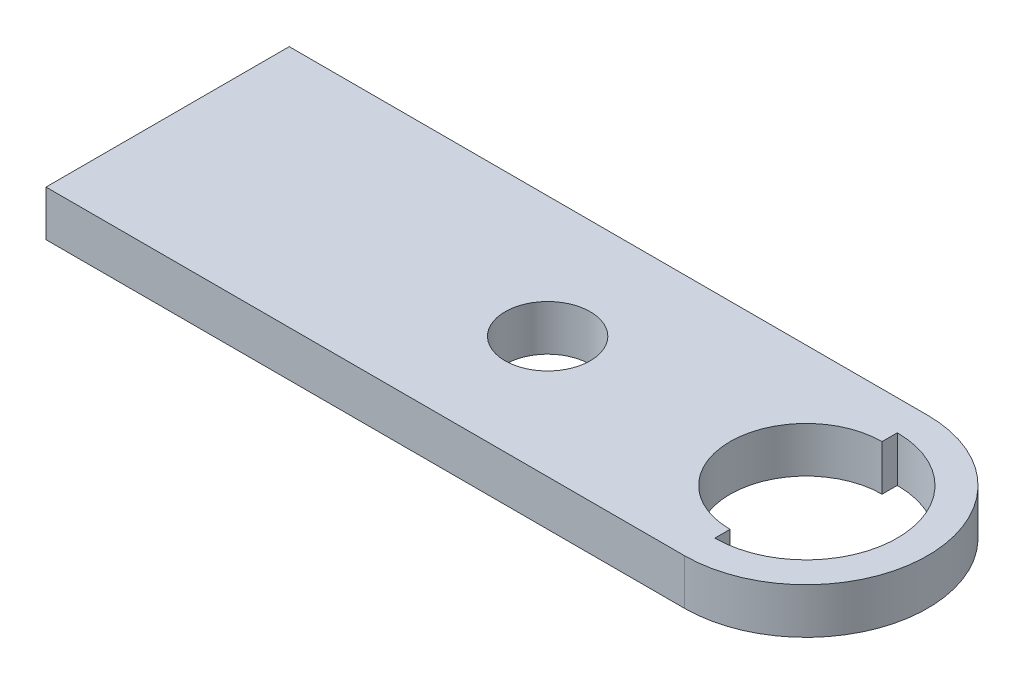
ISO-10303-21;
HEADER;
FILE_DESCRIPTION(('STEP AP214'),'2;1');
FILE_NAME('part.step','',(''),(''),'','','');
FILE_SCHEMA(('AUTOMOTIVE_DESIGN { 1 0 10303 214 1 1 1 1 }'));
ENDSEC;
DATA;
#1=APPLICATION_CONTEXT('core data for automotive mechanical design processes');
#2=APPLICATION_PROTOCOL_DEFINITION('international standard','automotive_design',2000,#1);
#3=PRODUCT_CONTEXT('',#1,'mechanical');
#4=PRODUCT('Part','Part','',(#3));
#5=PRODUCT_RELATED_PRODUCT_CATEGORY('part','',(#4));
#6=PRODUCT_DEFINITION_FORMATION('','',#4);
#7=PRODUCT_DEFINITION_CONTEXT('part definition',#1,'design');
#8=PRODUCT_DEFINITION('design','',#6,#7);
#9=PRODUCT_DEFINITION_SHAPE('','',#8);
#10=(LENGTH_UNIT() NAMED_UNIT(*) SI_UNIT(.MILLI.,.METRE.));
#11=(NAMED_UNIT(*) PLANE_ANGLE_UNIT() SI_UNIT($,.RADIAN.));
#12=(NAMED_UNIT(*) SI_UNIT($,.STERADIAN.) SOLID_ANGLE_UNIT());
#13=UNCERTAINTY_MEASURE_WITH_UNIT(LENGTH_MEASURE(1.E-05),#10,'distance_accuracy_value','');
#14=(GEOMETRIC_REPRESENTATION_CONTEXT(3) GLOBAL_UNCERTAINTY_ASSIGNED_CONTEXT((#13)) GLOBAL_UNIT_ASSIGNED_CONTEXT((#10,
#11,#12)) REPRESENTATION_CONTEXT('',''));
#15=CARTESIAN_POINT('',(0.,0.,0.));
#16=DIRECTION('',(0.,0.,1.));
#17=DIRECTION('',(1.,0.,0.));
#18=AXIS2_PLACEMENT_3D('',#15,#16,#17);
#19=CARTESIAN_POINT('',(95.2231224646768,15.,0.));
#20=DIRECTION('',(0.,1.,0.));
#21=DIRECTION('',(0.,0.,1.));
#22=AXIS2_PLACEMENT_3D('',#19,#20,#21);
#23=PLANE('',#22);
#24=CARTESIAN_POINT('',(10.2231224646768,15.,0.));
#25=DIRECTION('',(0.,1.,0.));
#26=DIRECTION('',(0.,0.,1.));
#27=AXIS2_PLACEMENT_3D('',#24,#25,#26);
#28=CIRCLE('',#27,14.);
#29=CARTESIAN_POINT('',(10.2231224646768,15.,14.));
#30=VERTEX_POINT('',#29);
#31=EDGE_CURVE('E254',#30,#30,#28,.T.);
#32=ORIENTED_EDGE('',*,*,#31,.F.);
#33=EDGE_LOOP('',(#32));
#34=FACE_BOUND('',#33,.T.);
#35=DIRECTION('',(0.,0.,1.));
#36=VECTOR('',#35,1.);
#37=CARTESIAN_POINT('',(-114.776877535323,15.,-40.));
#38=LINE('',#37,#36);
#39=CARTESIAN_POINT('',(-114.776877535323,15.,-40.));
#40=VERTEX_POINT('',#39);
#41=CARTESIAN_POINT('',(-114.776877535323,15.,40.));
#42=VERTEX_POINT('',#41);
#43=EDGE_CURVE('E155',#40,#42,#38,.T.);
#44=ORIENTED_EDGE('',*,*,#43,.T.);
#45=DIRECTION('',(1.,0.,0.));
#46=VECTOR('',#45,1.);
#47=CARTESIAN_POINT('',(-114.776877535323,15.,40.));
#48=LINE('',#47,#46);
#49=CARTESIAN_POINT('',(95.2231224646768,15.,40.));
#50=VERTEX_POINT('',#49);
#51=EDGE_CURVE('E159',#42,#50,#48,.T.);
#52=ORIENTED_EDGE('',*,*,#51,.T.);
#53=CARTESIAN_POINT('',(95.2231224646768,15.,0.));
#54=DIRECTION('',(0.,1.,0.));
#55=DIRECTION('',(0.,0.,1.));
#56=AXIS2_PLACEMENT_3D('',#53,#54,#55);
#57=CIRCLE('',#56,40.);
#58=CARTESIAN_POINT('',(95.2231224646768,15.,-40.));
#59=VERTEX_POINT('',#58);
#60=EDGE_CURVE('E163',#50,#59,#57,.T.);
#61=ORIENTED_EDGE('',*,*,#60,.T.);
#62=DIRECTION('',(-1.,0.,0.));
#63=VECTOR('',#62,1.);
#64=CARTESIAN_POINT('',(-114.776877535323,15.,-40.));
#65=LINE('',#64,#63);
#66=EDGE_CURVE('E166',#59,#40,#65,.T.);
#67=ORIENTED_EDGE('',*,*,#66,.T.);
#68=EDGE_LOOP('',(#44,#52,#61,#67));
#69=FACE_BOUND('',#68,.T.);
#70=DIRECTION('',(0.,0.,1.));
#71=VECTOR('',#70,1.);
#72=CARTESIAN_POINT('',(95.2231224646768,15.,-30.));
#73=LINE('',#72,#71);
#74=CARTESIAN_POINT('',(95.2231224646768,15.,-30.));
#75=VERTEX_POINT('',#74);
#76=CARTESIAN_POINT('',(95.2231224646768,15.,-25.));
#77=VERTEX_POINT('',#76);
#78=EDGE_CURVE('E114',#75,#77,#73,.T.);
#79=ORIENTED_EDGE('',*,*,#78,.F.);
#80=CARTESIAN_POINT('',(95.2231224646768,15.,0.));
#81=DIRECTION('',(0.,1.,0.));
#82=DIRECTION('',(0.,0.,1.));
#83=AXIS2_PLACEMENT_3D('',#80,#81,#82);
#84=CIRCLE('',#83,30.);
#85=CARTESIAN_POINT('',(95.2231224646768,15.,30.));
#86=VERTEX_POINT('',#85);
#87=EDGE_CURVE('E105',#86,#75,#84,.T.);
#88=ORIENTED_EDGE('',*,*,#87,.F.);
#89=DIRECTION('',(0.,0.,1.));
#90=VECTOR('',#89,1.);
#91=CARTESIAN_POINT('',(95.2231224646768,15.,25.));
#92=LINE('',#91,#90);
#93=CARTESIAN_POINT('',(95.2231224646768,15.,25.));
#94=VERTEX_POINT('',#93);
#95=EDGE_CURVE('E131',#94,#86,#92,.T.);
#96=ORIENTED_EDGE('',*,*,#95,.F.);
#97=CARTESIAN_POINT('',(95.2231224646768,15.,0.));
#98=DIRECTION('',(0.,1.,0.));
#99=DIRECTION('',(0.,0.,1.));
#100=AXIS2_PLACEMENT_3D('',#97,#98,#99);
#101=CIRCLE('',#100,25.);
#102=EDGE_CURVE('E127',#77,#94,#101,.T.);
#103=ORIENTED_EDGE('',*,*,#102,.F.);
#104=EDGE_LOOP('',(#79,#88,#96,#103));
#105=FACE_BOUND('',#104,.T.);
#106=ADVANCED_FACE('F39',(#34,#69,#105),#23,.T.);
#107=CARTESIAN_POINT('',(95.2231224646768,0.,0.));
#108=DIRECTION('',(0.,1.,0.));
#109=DIRECTION('',(0.,0.,1.));
#110=AXIS2_PLACEMENT_3D('',#107,#108,#109);
#111=PLANE('',#110);
#112=CARTESIAN_POINT('',(10.2231224646768,0.,0.));
#113=DIRECTION('',(0.,1.,0.));
#114=DIRECTION('',(0.,0.,1.));
#115=AXIS2_PLACEMENT_3D('',#112,#113,#114);
#116=CIRCLE('',#115,14.);
#117=CARTESIAN_POINT('',(10.2231224646768,0.,14.));
#118=VERTEX_POINT('',#117);
#119=EDGE_CURVE('E139',#118,#118,#116,.T.);
#120=ORIENTED_EDGE('',*,*,#119,.T.);
#121=EDGE_LOOP('',(#120));
#122=FACE_BOUND('',#121,.T.);
#123=DIRECTION('',(0.,0.,1.));
#124=VECTOR('',#123,1.);
#125=CARTESIAN_POINT('',(-114.776877535323,0.,-40.));
#126=LINE('',#125,#124);
#127=CARTESIAN_POINT('',(-114.776877535323,0.,-40.));
#128=VERTEX_POINT('',#127);
#129=CARTESIAN_POINT('',(-114.776877535323,0.,40.));
#130=VERTEX_POINT('',#129);
#131=EDGE_CURVE('E123',#128,#130,#126,.T.);
#132=ORIENTED_EDGE('',*,*,#131,.F.);
#133=DIRECTION('',(-1.,0.,0.));
#134=VECTOR('',#133,1.);
#135=CARTESIAN_POINT('',(-114.776877535323,0.,-40.));
#136=LINE('',#135,#134);
#137=CARTESIAN_POINT('',(95.2231224646768,0.,-40.));
#138=VERTEX_POINT('',#137);
#139=EDGE_CURVE('E160',#138,#128,#136,.T.);
#140=ORIENTED_EDGE('',*,*,#139,.F.);
#141=CARTESIAN_POINT('',(95.2231224646768,0.,0.));
#142=DIRECTION('',(0.,1.,0.));
#143=DIRECTION('',(0.,0.,1.));
#144=AXIS2_PLACEMENT_3D('',#141,#142,#143);
#145=CIRCLE('',#144,40.);
#146=CARTESIAN_POINT('',(95.2231224646768,0.,40.));
#147=VERTEX_POINT('',#146);
#148=EDGE_CURVE('E176',#147,#138,#145,.T.);
#149=ORIENTED_EDGE('',*,*,#148,.F.);
#150=DIRECTION('',(1.,0.,0.));
#151=VECTOR('',#150,1.);
#152=CARTESIAN_POINT('',(-114.776877535323,0.,40.));
#153=LINE('',#152,#151);
#154=EDGE_CURVE('E173',#130,#147,#153,.T.);
#155=ORIENTED_EDGE('',*,*,#154,.F.);
#156=EDGE_LOOP('',(#132,#140,#149,#155));
#157=FACE_BOUND('',#156,.T.);
#158=CARTESIAN_POINT('',(95.2231224646768,0.,0.));
#159=DIRECTION('',(0.,1.,0.));
#160=DIRECTION('',(0.,0.,1.));
#161=AXIS2_PLACEMENT_3D('',#158,#159,#160);
#162=CIRCLE('',#161,30.);
#163=CARTESIAN_POINT('',(95.2231224646768,0.,30.));
#164=VERTEX_POINT('',#163);
#165=CARTESIAN_POINT('',(95.2231224646768,0.,-30.));
#166=VERTEX_POINT('',#165);
#167=EDGE_CURVE('E63',#164,#166,#162,.T.);
#168=ORIENTED_EDGE('',*,*,#167,.T.);
#169=DIRECTION('',(0.,0.,1.));
#170=VECTOR('',#169,1.);
#171=CARTESIAN_POINT('',(95.2231224646768,0.,-30.));
#172=LINE('',#171,#170);
#173=CARTESIAN_POINT('',(95.2231224646768,0.,-25.));
#174=VERTEX_POINT('',#173);
#175=EDGE_CURVE('E121',#166,#174,#172,.T.);
#176=ORIENTED_EDGE('',*,*,#175,.T.);
#177=CARTESIAN_POINT('',(95.2231224646768,0.,0.));
#178=DIRECTION('',(0.,1.,0.));
#179=DIRECTION('',(0.,0.,1.));
#180=AXIS2_PLACEMENT_3D('',#177,#178,#179);
#181=CIRCLE('',#180,25.);
#182=CARTESIAN_POINT('',(95.2231224646768,0.,25.));
#183=VERTEX_POINT('',#182);
#184=EDGE_CURVE('E142',#174,#183,#181,.T.);
#185=ORIENTED_EDGE('',*,*,#184,.T.);
#186=DIRECTION('',(0.,0.,1.));
#187=VECTOR('',#186,1.);
#188=CARTESIAN_POINT('',(95.2231224646768,0.,25.));
#189=LINE('',#188,#187);
#190=EDGE_CURVE('E115',#183,#164,#189,.T.);
#191=ORIENTED_EDGE('',*,*,#190,.T.);
#192=EDGE_LOOP('',(#168,#176,#185,#191));
#193=FACE_BOUND('',#192,.T.);
#194=ADVANCED_FACE('F199',(#122,#157,#193),#111,.F.);
#195=CARTESIAN_POINT('',(-114.776877535323,15.,-40.));
#196=DIRECTION('',(1.,0.,0.));
#197=DIRECTION('',(0.,0.,-1.));
#198=AXIS2_PLACEMENT_3D('',#195,#196,#197);
#199=PLANE('',#198);
#200=ORIENTED_EDGE('',*,*,#131,.T.);
#201=DIRECTION('',(0.,-1.,0.));
#202=VECTOR('',#201,1.);
#203=CARTESIAN_POINT('',(-114.776877535323,15.,40.));
#204=LINE('',#203,#202);
#205=EDGE_CURVE('E11',#42,#130,#204,.T.);
#206=ORIENTED_EDGE('',*,*,#205,.F.);
#207=ORIENTED_EDGE('',*,*,#43,.F.);
#208=DIRECTION('',(0.,-1.,0.));
#209=VECTOR('',#208,1.);
#210=CARTESIAN_POINT('',(-114.776877535323,15.,-40.));
#211=LINE('',#210,#209);
#212=EDGE_CURVE('E169',#40,#128,#211,.T.);
#213=ORIENTED_EDGE('',*,*,#212,.T.);
#214=EDGE_LOOP('',(#200,#206,#207,#213));
#215=FACE_BOUND('',#214,.T.);
#216=ADVANCED_FACE('F41',(#215),#199,.F.);
#217=CARTESIAN_POINT('',(-114.776877535323,15.,40.));
#218=DIRECTION('',(0.,0.,-1.));
#219=DIRECTION('',(-1.,0.,0.));
#220=AXIS2_PLACEMENT_3D('',#217,#218,#219);
#221=PLANE('',#220);
#222=ORIENTED_EDGE('',*,*,#154,.T.);
#223=DIRECTION('',(0.,-1.,0.));
#224=VECTOR('',#223,1.);
#225=CARTESIAN_POINT('',(95.2231224646768,15.,40.));
#226=LINE('',#225,#224);
#227=EDGE_CURVE('E48',#50,#147,#226,.T.);
#228=ORIENTED_EDGE('',*,*,#227,.F.);
#229=ORIENTED_EDGE('',*,*,#51,.F.);
#230=ORIENTED_EDGE('',*,*,#205,.T.);
#231=EDGE_LOOP('',(#222,#228,#229,#230));
#232=FACE_BOUND('',#231,.T.);
#233=ADVANCED_FACE('F209',(#232),#221,.F.);
#234=CARTESIAN_POINT('',(95.2231224646768,15.,0.));
#235=DIRECTION('',(0.,-1.,0.));
#236=DIRECTION('',(0.,0.,-1.));
#237=AXIS2_PLACEMENT_3D('',#234,#235,#236);
#238=CYLINDRICAL_SURFACE('',#237,40.);
#239=ORIENTED_EDGE('',*,*,#148,.T.);
#240=DIRECTION('',(0.,-1.,0.));
#241=VECTOR('',#240,1.);
#242=CARTESIAN_POINT('',(95.2231224646768,15.,-40.));
#243=LINE('',#242,#241);
#244=EDGE_CURVE('E184',#59,#138,#243,.T.);
#245=ORIENTED_EDGE('',*,*,#244,.F.);
#246=ORIENTED_EDGE('',*,*,#60,.F.);
#247=ORIENTED_EDGE('',*,*,#227,.T.);
#248=EDGE_LOOP('',(#239,#245,#246,#247));
#249=FACE_BOUND('',#248,.T.);
#250=ADVANCED_FACE('F193',(#249),#238,.T.);
#251=CARTESIAN_POINT('',(-114.776877535323,15.,-40.));
#252=DIRECTION('',(0.,0.,1.));
#253=DIRECTION('',(1.,0.,0.));
#254=AXIS2_PLACEMENT_3D('',#251,#252,#253);
#255=PLANE('',#254);
#256=ORIENTED_EDGE('',*,*,#139,.T.);
#257=ORIENTED_EDGE('',*,*,#212,.F.);
#258=ORIENTED_EDGE('',*,*,#66,.F.);
#259=ORIENTED_EDGE('',*,*,#244,.T.);
#260=EDGE_LOOP('',(#256,#257,#258,#259));
#261=FACE_BOUND('',#260,.T.);
#262=ADVANCED_FACE('F203',(#261),#255,.F.);
#263=CARTESIAN_POINT('',(95.2231224646768,15.,0.));
#264=DIRECTION('',(0.,-1.,0.));
#265=DIRECTION('',(0.,0.,-1.));
#266=AXIS2_PLACEMENT_3D('',#263,#264,#265);
#267=CYLINDRICAL_SURFACE('',#266,30.);
#268=ORIENTED_EDGE('',*,*,#167,.F.);
#269=DIRECTION('',(0.,-1.,0.));
#270=VECTOR('',#269,1.);
#271=CARTESIAN_POINT('',(95.2231224646768,15.,30.));
#272=LINE('',#271,#270);
#273=EDGE_CURVE('E109',#86,#164,#272,.T.);
#274=ORIENTED_EDGE('',*,*,#273,.F.);
#275=ORIENTED_EDGE('',*,*,#87,.T.);
#276=DIRECTION('',(0.,-1.,0.));
#277=VECTOR('',#276,1.);
#278=CARTESIAN_POINT('',(95.2231224646768,15.,-30.));
#279=LINE('',#278,#277);
#280=EDGE_CURVE('E108',#75,#166,#279,.T.);
#281=ORIENTED_EDGE('',*,*,#280,.T.);
#282=EDGE_LOOP('',(#268,#274,#275,#281));
#283=FACE_BOUND('',#282,.T.);
#284=ADVANCED_FACE('F107',(#283),#267,.F.);
#285=CARTESIAN_POINT('',(95.2231224646768,15.,-30.));
#286=DIRECTION('',(1.,0.,0.));
#287=DIRECTION('',(0.,0.,-1.));
#288=AXIS2_PLACEMENT_3D('',#285,#286,#287);
#289=PLANE('',#288);
#290=ORIENTED_EDGE('',*,*,#175,.F.);
#291=ORIENTED_EDGE('',*,*,#280,.F.);
#292=ORIENTED_EDGE('',*,*,#78,.T.);
#293=DIRECTION('',(0.,-1.,0.));
#294=VECTOR('',#293,1.);
#295=CARTESIAN_POINT('',(95.2231224646768,15.,-25.));
#296=LINE('',#295,#294);
#297=EDGE_CURVE('E124',#77,#174,#296,.T.);
#298=ORIENTED_EDGE('',*,*,#297,.T.);
#299=EDGE_LOOP('',(#290,#291,#292,#298));
#300=FACE_BOUND('',#299,.T.);
#301=ADVANCED_FACE('F118',(#300),#289,.T.);
#302=CARTESIAN_POINT('',(95.2231224646768,15.,0.));
#303=DIRECTION('',(0.,-1.,0.));
#304=DIRECTION('',(0.,0.,-1.));
#305=AXIS2_PLACEMENT_3D('',#302,#303,#304);
#306=CYLINDRICAL_SURFACE('',#305,25.);
#307=ORIENTED_EDGE('',*,*,#184,.F.);
#308=ORIENTED_EDGE('',*,*,#297,.F.);
#309=ORIENTED_EDGE('',*,*,#102,.T.);
#310=DIRECTION('',(0.,-1.,0.));
#311=VECTOR('',#310,1.);
#312=CARTESIAN_POINT('',(95.2231224646768,15.,25.));
#313=LINE('',#312,#311);
#314=EDGE_CURVE('E55',#94,#183,#313,.T.);
#315=ORIENTED_EDGE('',*,*,#314,.T.);
#316=EDGE_LOOP('',(#307,#308,#309,#315));
#317=FACE_BOUND('',#316,.T.);
#318=ADVANCED_FACE('F235',(#317),#306,.F.);
#319=CARTESIAN_POINT('',(95.2231224646768,15.,25.));
#320=DIRECTION('',(1.,0.,0.));
#321=DIRECTION('',(0.,0.,-1.));
#322=AXIS2_PLACEMENT_3D('',#319,#320,#321);
#323=PLANE('',#322);
#324=ORIENTED_EDGE('',*,*,#190,.F.);
#325=ORIENTED_EDGE('',*,*,#314,.F.);
#326=ORIENTED_EDGE('',*,*,#95,.T.);
#327=ORIENTED_EDGE('',*,*,#273,.T.);
#328=EDGE_LOOP('',(#324,#325,#326,#327));
#329=FACE_BOUND('',#328,.T.);
#330=ADVANCED_FACE('F239',(#329),#323,.T.);
#331=CARTESIAN_POINT('',(10.2231224646768,15.,0.));
#332=DIRECTION('',(0.,1.,0.));
#333=DIRECTION('',(0.,0.,1.));
#334=AXIS2_PLACEMENT_3D('',#331,#332,#333);
#335=CYLINDRICAL_SURFACE('',#334,14.);
#336=ORIENTED_EDGE('',*,*,#119,.F.);
#337=EDGE_LOOP('',(#336));
#338=FACE_BOUND('',#337,.T.);
#339=ORIENTED_EDGE('',*,*,#31,.T.);
#340=EDGE_LOOP('',(#339));
#341=FACE_BOUND('',#340,.T.);
#342=ADVANCED_FACE('F245',(#338,#341),#335,.F.);
#343=CLOSED_SHELL('',(#106,#194,#216,#233,#250,#262,#284,#301,#318,#330,#342));
#344=MANIFOLD_SOLID_BREP('B2',#343);
#345=ADVANCED_BREP_SHAPE_REPRESENTATION('',(#18,#344),#14);
#346=SHAPE_DEFINITION_REPRESENTATION(#9,#345);
ENDSEC;
END-ISO-10303-21;
